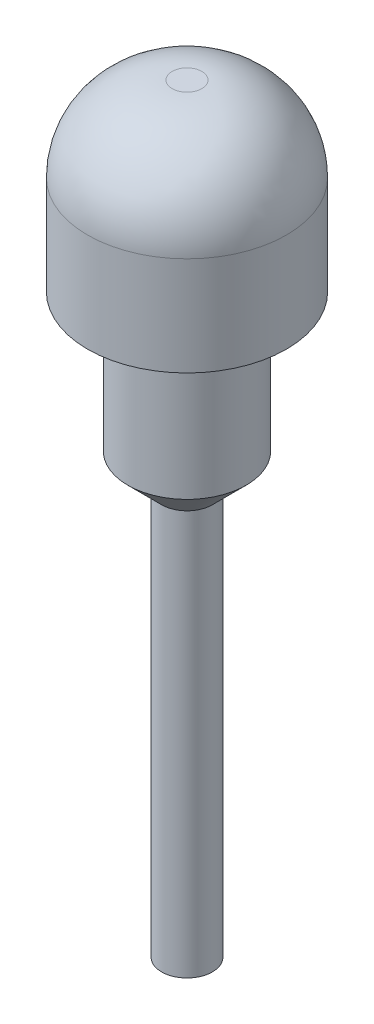
ISO-10303-21;
HEADER;
FILE_DESCRIPTION(('STEP AP214'),'2;1');
FILE_NAME('part.step','',(''),(''),'','','');
FILE_SCHEMA(('AUTOMOTIVE_DESIGN { 1 0 10303 214 1 1 1 1 }'));
ENDSEC;
DATA;
#1=APPLICATION_CONTEXT('core data for automotive mechanical design processes');
#2=APPLICATION_PROTOCOL_DEFINITION('international standard','automotive_design',2000,#1);
#3=PRODUCT_CONTEXT('',#1,'mechanical');
#4=PRODUCT('Part','Part','',(#3));
#5=PRODUCT_RELATED_PRODUCT_CATEGORY('part','',(#4));
#6=PRODUCT_DEFINITION_FORMATION('','',#4);
#7=PRODUCT_DEFINITION_CONTEXT('part definition',#1,'design');
#8=PRODUCT_DEFINITION('design','',#6,#7);
#9=PRODUCT_DEFINITION_SHAPE('','',#8);
#10=(LENGTH_UNIT() NAMED_UNIT(*) SI_UNIT(.MILLI.,.METRE.));
#11=(NAMED_UNIT(*) PLANE_ANGLE_UNIT() SI_UNIT($,.RADIAN.));
#12=(NAMED_UNIT(*) SI_UNIT($,.STERADIAN.) SOLID_ANGLE_UNIT());
#13=UNCERTAINTY_MEASURE_WITH_UNIT(LENGTH_MEASURE(1.E-05),#10,'distance_accuracy_value','');
#14=(GEOMETRIC_REPRESENTATION_CONTEXT(3) GLOBAL_UNCERTAINTY_ASSIGNED_CONTEXT((#13)) GLOBAL_UNIT_ASSIGNED_CONTEXT((#10,
#11,#12)) REPRESENTATION_CONTEXT('',''));
#15=CARTESIAN_POINT('',(0.,0.,0.));
#16=DIRECTION('',(0.,0.,1.));
#17=DIRECTION('',(1.,0.,0.));
#18=AXIS2_PLACEMENT_3D('',#15,#16,#17);
#19=CARTESIAN_POINT('',(0.,4.5,0.));
#20=DIRECTION('',(0.,-1.,0.));
#21=DIRECTION('',(0.,0.,-1.));
#22=AXIS2_PLACEMENT_3D('',#19,#20,#21);
#23=CYLINDRICAL_SURFACE('',#22,1.75);
#24=CARTESIAN_POINT('',(0.,1.,0.));
#25=DIRECTION('',(0.,1.,0.));
#26=DIRECTION('',(0.,0.,1.));
#27=AXIS2_PLACEMENT_3D('',#24,#25,#26);
#28=CIRCLE('',#27,1.75);
#29=CARTESIAN_POINT('',(0.,1.,1.75));
#30=VERTEX_POINT('',#29);
#31=EDGE_CURVE('E10',#30,#30,#28,.T.);
#32=ORIENTED_EDGE('',*,*,#31,.T.);
#33=EDGE_LOOP('',(#32));
#34=FACE_BOUND('',#33,.T.);
#35=CARTESIAN_POINT('',(0.,4.5,0.));
#36=DIRECTION('',(0.,1.,0.));
#37=DIRECTION('',(0.,0.,1.));
#38=AXIS2_PLACEMENT_3D('',#35,#36,#37);
#39=CIRCLE('',#38,1.75);
#40=CARTESIAN_POINT('',(0.,4.5,1.75));
#41=VERTEX_POINT('',#40);
#42=EDGE_CURVE('E41',#41,#41,#39,.T.);
#43=ORIENTED_EDGE('',*,*,#42,.F.);
#44=EDGE_LOOP('',(#43));
#45=FACE_BOUND('',#44,.T.);
#46=ADVANCED_FACE('F15',(#34,#45),#23,.T.);
#47=CARTESIAN_POINT('',(0.,-11.9605,0.));
#48=DIRECTION('',(0.,1.,0.));
#49=DIRECTION('',(0.,0.,1.));
#50=AXIS2_PLACEMENT_3D('',#47,#48,#49);
#51=CYLINDRICAL_SURFACE('',#50,0.75);
#52=CARTESIAN_POINT('',(0.,-11.9605,0.));
#53=DIRECTION('',(0.,-1.,0.));
#54=DIRECTION('',(0.,0.,-1.));
#55=AXIS2_PLACEMENT_3D('',#52,#53,#54);
#56=CIRCLE('',#55,0.75);
#57=CARTESIAN_POINT('',(0.,-11.9605,-0.75));
#58=VERTEX_POINT('',#57);
#59=EDGE_CURVE('E44',#58,#58,#56,.T.);
#60=ORIENTED_EDGE('',*,*,#59,.F.);
#61=EDGE_LOOP('',(#60));
#62=FACE_BOUND('',#61,.T.);
#63=CARTESIAN_POINT('',(0.,0.,0.));
#64=DIRECTION('',(0.,1.,0.));
#65=DIRECTION('',(0.,0.,1.));
#66=AXIS2_PLACEMENT_3D('',#63,#64,#65);
#67=CIRCLE('',#66,0.75);
#68=CARTESIAN_POINT('',(0.,0.,0.75));
#69=VERTEX_POINT('',#68);
#70=EDGE_CURVE('E38',#69,#69,#67,.F.);
#71=ORIENTED_EDGE('',*,*,#70,.T.);
#72=EDGE_LOOP('',(#71));
#73=FACE_BOUND('',#72,.T.);
#74=ADVANCED_FACE('F50',(#62,#73),#51,.T.);
#75=CARTESIAN_POINT('',(0.,-11.9605,0.));
#76=DIRECTION('',(0.,-1.,0.));
#77=DIRECTION('',(0.,0.,-1.));
#78=AXIS2_PLACEMENT_3D('',#75,#76,#77);
#79=PLANE('',#78);
#80=ORIENTED_EDGE('',*,*,#59,.T.);
#81=EDGE_LOOP('',(#80));
#82=FACE_BOUND('',#81,.T.);
#83=ADVANCED_FACE('F48',(#82),#79,.T.);
#84=CARTESIAN_POINT('',(0.,10.5,0.));
#85=DIRECTION('',(0.,-1.,0.));
#86=DIRECTION('',(0.,0.,-1.));
#87=AXIS2_PLACEMENT_3D('',#84,#85,#86);
#88=CYLINDRICAL_SURFACE('',#87,2.94);
#89=CARTESIAN_POINT('',(0.,5.07735026918963,0.));
#90=DIRECTION('',(0.,1.,0.));
#91=DIRECTION('',(0.,0.,1.));
#92=AXIS2_PLACEMENT_3D('',#89,#90,#91);
#93=CIRCLE('',#92,2.94);
#94=CARTESIAN_POINT('',(0.,5.07735026918963,2.94));
#95=VERTEX_POINT('',#94);
#96=EDGE_CURVE('E26',#95,#95,#93,.T.);
#97=ORIENTED_EDGE('',*,*,#96,.T.);
#98=EDGE_LOOP('',(#97));
#99=FACE_BOUND('',#98,.T.);
#100=CARTESIAN_POINT('',(0.,8.,0.));
#101=DIRECTION('',(0.,1.,0.));
#102=DIRECTION('',(0.,0.,1.));
#103=AXIS2_PLACEMENT_3D('',#100,#101,#102);
#104=CIRCLE('',#103,2.94);
#105=CARTESIAN_POINT('',(0.,8.,2.94));
#106=VERTEX_POINT('',#105);
#107=EDGE_CURVE('E30',#106,#106,#104,.F.);
#108=ORIENTED_EDGE('',*,*,#107,.T.);
#109=EDGE_LOOP('',(#108));
#110=FACE_BOUND('',#109,.T.);
#111=ADVANCED_FACE('F85',(#99,#110),#88,.T.);
#112=CARTESIAN_POINT('',(0.,10.5,0.));
#113=DIRECTION('',(0.,1.,0.));
#114=DIRECTION('',(0.,0.,1.));
#115=AXIS2_PLACEMENT_3D('',#112,#113,#114);
#116=PLANE('',#115);
#117=CARTESIAN_POINT('',(0.,10.5,0.));
#118=DIRECTION('',(0.,1.,0.));
#119=DIRECTION('',(0.,0.,1.));
#120=AXIS2_PLACEMENT_3D('',#117,#118,#119);
#121=CIRCLE('',#120,0.439999999999999);
#122=CARTESIAN_POINT('',(0.,10.5,0.439999999999999));
#123=VERTEX_POINT('',#122);
#124=EDGE_CURVE('E35',#123,#123,#121,.T.);
#125=ORIENTED_EDGE('',*,*,#124,.T.);
#126=EDGE_LOOP('',(#125));
#127=FACE_BOUND('',#126,.T.);
#128=ADVANCED_FACE('F78',(#127),#116,.T.);
#129=CARTESIAN_POINT('',(0.,4.5,0.));
#130=DIRECTION('',(0.,1.,0.));
#131=DIRECTION('',(0.,0.,1.));
#132=AXIS2_PLACEMENT_3D('',#129,#130,#131);
#133=PLANE('',#132);
#134=CARTESIAN_POINT('',(0.,4.5,0.));
#135=DIRECTION('',(0.,1.,0.));
#136=DIRECTION('',(0.,0.,1.));
#137=AXIS2_PLACEMENT_3D('',#134,#135,#136);
#138=CIRCLE('',#137,1.93999999999999);
#139=CARTESIAN_POINT('',(0.,4.5,1.93999999999999));
#140=VERTEX_POINT('',#139);
#141=EDGE_CURVE('E22',#140,#140,#138,.F.);
#142=ORIENTED_EDGE('',*,*,#141,.T.);
#143=EDGE_LOOP('',(#142));
#144=FACE_BOUND('',#143,.T.);
#145=ORIENTED_EDGE('',*,*,#42,.T.);
#146=EDGE_LOOP('',(#145));
#147=FACE_BOUND('',#146,.T.);
#148=ADVANCED_FACE('F73',(#144,#147),#133,.F.);
#149=CARTESIAN_POINT('',(0.,8.,0.));
#150=DIRECTION('',(0.,1.,0.));
#151=DIRECTION('',(0.,0.,1.));
#152=AXIS2_PLACEMENT_3D('',#149,#150,#151);
#153=DEGENERATE_TOROIDAL_SURFACE('',#152,0.439999999999999,2.5,.T.);
#154=ORIENTED_EDGE('',*,*,#107,.F.);
#155=EDGE_LOOP('',(#154));
#156=FACE_BOUND('',#155,.T.);
#157=ORIENTED_EDGE('',*,*,#124,.F.);
#158=EDGE_LOOP('',(#157));
#159=FACE_BOUND('',#158,.T.);
#160=ADVANCED_FACE('F63',(#156,#159),#153,.T.);
#161=CARTESIAN_POINT('',(0.,5.07735026918963,0.));
#162=DIRECTION('',(0.,1.,0.));
#163=DIRECTION('',(0.,0.,1.));
#164=AXIS2_PLACEMENT_3D('',#161,#162,#163);
#165=CONICAL_SURFACE('',#164,2.94,1.0471975511966);
#166=ORIENTED_EDGE('',*,*,#141,.F.);
#167=EDGE_LOOP('',(#166));
#168=FACE_BOUND('',#167,.T.);
#169=ORIENTED_EDGE('',*,*,#96,.F.);
#170=EDGE_LOOP('',(#169));
#171=FACE_BOUND('',#170,.T.);
#172=ADVANCED_FACE('F58',(#168,#171),#165,.T.);
#173=CARTESIAN_POINT('',(0.,1.,0.));
#174=DIRECTION('',(0.,1.,0.));
#175=DIRECTION('',(0.,0.,1.));
#176=AXIS2_PLACEMENT_3D('',#173,#174,#175);
#177=CONICAL_SURFACE('',#176,1.75,0.78539816339745);
#178=ORIENTED_EDGE('',*,*,#70,.F.);
#179=EDGE_LOOP('',(#178));
#180=FACE_BOUND('',#179,.T.);
#181=ORIENTED_EDGE('',*,*,#31,.F.);
#182=EDGE_LOOP('',(#181));
#183=FACE_BOUND('',#182,.T.);
#184=ADVANCED_FACE('F17',(#180,#183),#177,.T.);
#185=CLOSED_SHELL('',(#46,#74,#83,#111,#128,#148,#160,#172,#184));
#186=MANIFOLD_SOLID_BREP('B1',#185);
#187=ADVANCED_BREP_SHAPE_REPRESENTATION('',(#18,#186),#14);
#188=SHAPE_DEFINITION_REPRESENTATION(#9,#187);
ENDSEC;
END-ISO-10303-21;
